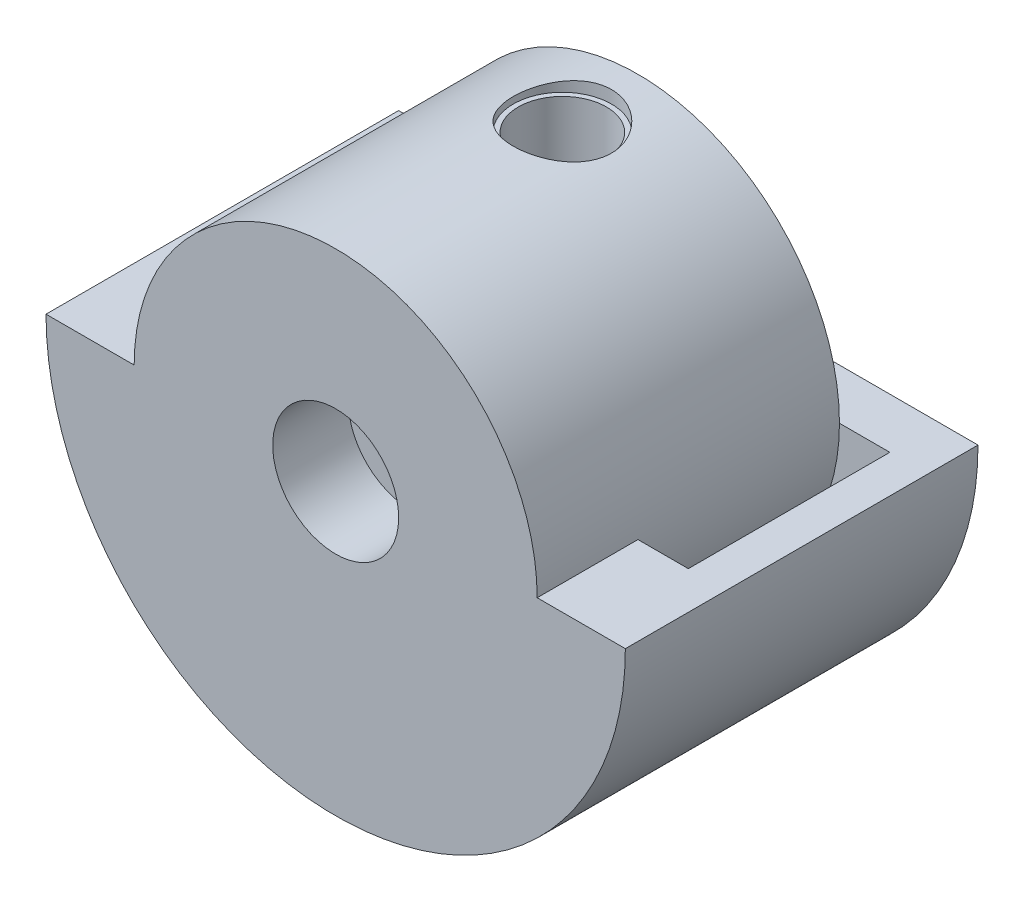
ISO-10303-21;
HEADER;
FILE_DESCRIPTION(('STEP AP214'),'2;1');
FILE_NAME('part.step','',(''),(''),'','','');
FILE_SCHEMA(('AUTOMOTIVE_DESIGN { 1 0 10303 214 1 1 1 1 }'));
ENDSEC;
DATA;
#1=APPLICATION_CONTEXT('core data for automotive mechanical design processes');
#2=APPLICATION_PROTOCOL_DEFINITION('international standard','automotive_design',2000,#1);
#3=PRODUCT_CONTEXT('',#1,'mechanical');
#4=PRODUCT('Part','Part','',(#3));
#5=PRODUCT_RELATED_PRODUCT_CATEGORY('part','',(#4));
#6=PRODUCT_DEFINITION_FORMATION('','',#4);
#7=PRODUCT_DEFINITION_CONTEXT('part definition',#1,'design');
#8=PRODUCT_DEFINITION('design','',#6,#7);
#9=PRODUCT_DEFINITION_SHAPE('','',#8);
#10=(LENGTH_UNIT() NAMED_UNIT(*) SI_UNIT(.MILLI.,.METRE.));
#11=(NAMED_UNIT(*) PLANE_ANGLE_UNIT() SI_UNIT($,.RADIAN.));
#12=(NAMED_UNIT(*) SI_UNIT($,.STERADIAN.) SOLID_ANGLE_UNIT());
#13=UNCERTAINTY_MEASURE_WITH_UNIT(LENGTH_MEASURE(1.E-05),#10,'distance_accuracy_value','');
#14=(GEOMETRIC_REPRESENTATION_CONTEXT(3) GLOBAL_UNCERTAINTY_ASSIGNED_CONTEXT((#13)) GLOBAL_UNIT_ASSIGNED_CONTEXT((#10,
#11,#12)) REPRESENTATION_CONTEXT('',''));
#15=CARTESIAN_POINT('',(0.,0.,0.));
#16=DIRECTION('',(0.,0.,1.));
#17=DIRECTION('',(1.,0.,0.));
#18=AXIS2_PLACEMENT_3D('',#15,#16,#17);
#19=CARTESIAN_POINT('',(0.,0.,-6.));
#20=DIRECTION('',(0.,0.,1.));
#21=DIRECTION('',(1.,0.,0.));
#22=AXIS2_PLACEMENT_3D('',#19,#20,#21);
#23=CYLINDRICAL_SURFACE('',#22,5.);
#24=CARTESIAN_POINT('',(0.,0.,-6.));
#25=DIRECTION('',(0.,0.,1.));
#26=DIRECTION('',(1.,0.,0.));
#27=AXIS2_PLACEMENT_3D('',#24,#25,#26);
#28=CIRCLE('',#27,5.);
#29=CARTESIAN_POINT('',(-5.,0.,-6.));
#30=VERTEX_POINT('',#29);
#31=CARTESIAN_POINT('',(5.,0.,-6.));
#32=VERTEX_POINT('',#31);
#33=EDGE_CURVE('E126',#30,#32,#28,.T.);
#34=ORIENTED_EDGE('',*,*,#33,.T.);
#35=DIRECTION('',(0.,0.,1.));
#36=VECTOR('',#35,1.);
#37=CARTESIAN_POINT('',(5.,0.,-8.));
#38=LINE('',#37,#36);
#39=CARTESIAN_POINT('',(5.,0.,-8.));
#40=VERTEX_POINT('',#39);
#41=EDGE_CURVE('E130',#40,#32,#38,.T.);
#42=ORIENTED_EDGE('',*,*,#41,.F.);
#43=CARTESIAN_POINT('',(0.,0.,-8.));
#44=DIRECTION('',(0.,0.,1.));
#45=DIRECTION('',(-1.,0.,0.));
#46=AXIS2_PLACEMENT_3D('',#43,#44,#45);
#47=CIRCLE('',#46,5.);
#48=CARTESIAN_POINT('',(-5.,0.,-8.));
#49=VERTEX_POINT('',#48);
#50=EDGE_CURVE('E159',#49,#40,#47,.T.);
#51=ORIENTED_EDGE('',*,*,#50,.F.);
#52=DIRECTION('',(0.,0.,1.));
#53=VECTOR('',#52,1.);
#54=CARTESIAN_POINT('',(-5.,0.,-8.));
#55=LINE('',#54,#53);
#56=EDGE_CURVE('E133',#49,#30,#55,.T.);
#57=ORIENTED_EDGE('',*,*,#56,.T.);
#58=EDGE_LOOP('',(#34,#42,#51,#57));
#59=FACE_BOUND('',#58,.T.);
#60=ADVANCED_FACE('F49',(#59),#23,.F.);
#61=CARTESIAN_POINT('',(0.,0.,-6.));
#62=DIRECTION('',(0.,0.,1.));
#63=DIRECTION('',(1.,0.,0.));
#64=AXIS2_PLACEMENT_3D('',#61,#62,#63);
#65=PLANE('',#64);
#66=DIRECTION('',(1.,0.,0.));
#67=VECTOR('',#66,1.);
#68=CARTESIAN_POINT('',(-10.,0.,-6.));
#69=LINE('',#68,#67);
#70=CARTESIAN_POINT('',(-8.,0.,-6.));
#71=VERTEX_POINT('',#70);
#72=EDGE_CURVE('E78',#71,#30,#69,.T.);
#73=ORIENTED_EDGE('',*,*,#72,.F.);
#74=CARTESIAN_POINT('',(0.,0.,-6.));
#75=DIRECTION('',(0.,0.,1.));
#76=DIRECTION('',(1.,0.,0.));
#77=AXIS2_PLACEMENT_3D('',#74,#75,#76);
#78=CIRCLE('',#77,8.);
#79=CARTESIAN_POINT('',(8.,0.,-6.));
#80=VERTEX_POINT('',#79);
#81=EDGE_CURVE('E142',#80,#71,#78,.T.);
#82=ORIENTED_EDGE('',*,*,#81,.F.);
#83=DIRECTION('',(1.,0.,0.));
#84=VECTOR('',#83,1.);
#85=CARTESIAN_POINT('',(14.9666295470958,0.,-6.));
#86=LINE('',#85,#84);
#87=EDGE_CURVE('E139',#32,#80,#86,.T.);
#88=ORIENTED_EDGE('',*,*,#87,.F.);
#89=ORIENTED_EDGE('',*,*,#33,.F.);
#90=EDGE_LOOP('',(#73,#82,#88,#89));
#91=FACE_BOUND('',#90,.T.);
#92=CARTESIAN_POINT('',(0.,0.,-6.));
#93=DIRECTION('',(0.,0.,1.));
#94=DIRECTION('',(1.,0.,0.));
#95=AXIS2_PLACEMENT_3D('',#92,#93,#94);
#96=CIRCLE('',#95,3.5);
#97=CARTESIAN_POINT('',(3.5,0.,-6.));
#98=VERTEX_POINT('',#97);
#99=EDGE_CURVE('E135',#98,#98,#96,.T.);
#100=ORIENTED_EDGE('',*,*,#99,.T.);
#101=EDGE_LOOP('',(#100));
#102=FACE_BOUND('',#101,.T.);
#103=ADVANCED_FACE('F140',(#91,#102),#65,.F.);
#104=CARTESIAN_POINT('',(0.,-4.,-3.));
#105=DIRECTION('',(0.,1.,0.));
#106=DIRECTION('',(0.,0.,1.));
#107=AXIS2_PLACEMENT_3D('',#104,#105,#106);
#108=CYLINDRICAL_SURFACE('',#107,1.75);
#109=CARTESIAN_POINT('',(0.,7.5,-3.));
#110=DIRECTION('',(0.,1.,0.));
#111=DIRECTION('',(0.,0.,1.));
#112=AXIS2_PLACEMENT_3D('',#109,#110,#111);
#113=CIRCLE('',#112,1.75);
#114=CARTESIAN_POINT('',(0.,7.5,-1.25));
#115=VERTEX_POINT('',#114);
#116=EDGE_CURVE('E208',#115,#115,#113,.F.);
#117=ORIENTED_EDGE('',*,*,#116,.F.);
#118=EDGE_LOOP('',(#117));
#119=FACE_BOUND('',#118,.T.);
#120=CARTESIAN_POINT('',(0.,3.5,-1.25));
#121=CARTESIAN_POINT('',(-0.0920009351646585,3.49999498458822,-1.25000577905509));
#122=CARTESIAN_POINT('',(-0.184111549470734,3.49633359284574,-1.25729762796185));
#123=CARTESIAN_POINT('',(-0.365610411720568,3.48204773065025,-1.28614254059769));
#124=CARTESIAN_POINT('',(-0.454993151748852,3.47141003700609,-1.30772268774618));
#125=CARTESIAN_POINT('',(-0.628133703540786,3.44428488955907,-1.3640891650791));
#126=CARTESIAN_POINT('',(-0.711911905143506,3.4278201856069,-1.39882417243394));
#127=CARTESIAN_POINT('',(-0.872327079411548,3.39055108902582,-1.48024858738872));
#128=CARTESIAN_POINT('',(-0.948964614482603,3.36974703858669,-1.52693705243551));
#129=CARTESIAN_POINT('',(-1.09813868108334,3.32423451951608,-1.63415518659925));
#130=CARTESIAN_POINT('',(-1.17014661946369,3.2993659847319,-1.69535133866937));
#131=CARTESIAN_POINT('',(-1.30336402851721,3.249049479318,-1.82841258868231));
#132=CARTESIAN_POINT('',(-1.36456527043684,3.22360108365811,-1.90028574060177));
#133=CARTESIAN_POINT('',(-1.47919100078799,3.17273164595358,-2.05934586166592));
#134=CARTESIAN_POINT('',(-1.53164433721536,3.14746577197731,-2.14728817210535));
#135=CARTESIAN_POINT('',(-1.62079439705872,3.10250462851561,-2.33214283797588));
#136=CARTESIAN_POINT('',(-1.65750237619108,3.08280538312232,-2.42904872526481));
#137=CARTESIAN_POINT('',(-1.71173177383003,3.05301267316165,-2.62316393448836));
#138=CARTESIAN_POINT('',(-1.73027024989077,3.04241475271499,-2.72000779111794));
#139=CARTESIAN_POINT('',(-1.75074723829048,3.03068307409923,-2.91596296611408));
#140=CARTESIAN_POINT('',(-1.75270215465288,3.02953996350754,-3.01507194652452));
#141=CARTESIAN_POINT('',(-1.74070275255151,3.03644127950185,-3.20000054255189));
#142=CARTESIAN_POINT('',(-1.72862297918944,3.04340336408524,-3.28599205464034));
#143=CARTESIAN_POINT('',(-1.69214473584963,3.06383400284238,-3.45451334140282));
#144=CARTESIAN_POINT('',(-1.66774234182089,3.07730462955608,-3.5370420042843));
#145=CARTESIAN_POINT('',(-1.60686711567551,3.10953083722297,-3.6986509819899));
#146=CARTESIAN_POINT('',(-1.57012636745299,3.12840221161997,-3.77760619787513));
#147=CARTESIAN_POINT('',(-1.485822953419,3.16930957492456,-3.92861001203251));
#148=CARTESIAN_POINT('',(-1.43825542667182,3.19134698365334,-4.00065548730016));
#149=CARTESIAN_POINT('',(-1.32661559609738,3.2394802633075,-4.14541219230065));
#150=CARTESIAN_POINT('',(-1.26121530214624,3.26573642914306,-4.21704952875828));
#151=CARTESIAN_POINT('',(-1.1192222627974,3.31708340775713,-4.34878698253408));
#152=CARTESIAN_POINT('',(-1.042624199005,3.34217365927902,-4.40888158605929));
#153=CARTESIAN_POINT('',(-0.875903885205735,3.38978477745187,-4.51844990680202));
#154=CARTESIAN_POINT('',(-0.785318785298965,3.41213222283513,-4.56730082678005));
#155=CARTESIAN_POINT('',(-0.595815877105394,3.45026291962174,-4.64866980082527));
#156=CARTESIAN_POINT('',(-0.496904758464233,3.46605138151218,-4.68120082377654));
#157=CARTESIAN_POINT('',(-0.302341360406229,3.48817584047512,-4.72633195650418));
#158=CARTESIAN_POINT('',(-0.207097678459571,3.49518642027292,-4.74035966255687));
#159=CARTESIAN_POINT('',(-0.0153642999113658,3.50127773553431,-4.75256327948535));
#160=CARTESIAN_POINT('',(0.0811247847723399,3.50036222762308,-4.75074669986907));
#161=CARTESIAN_POINT('',(0.264657700975477,3.49109586443511,-4.7321382952672));
#162=CARTESIAN_POINT('',(0.351853964087378,3.48332679954295,-4.71651806772251));
#163=CARTESIAN_POINT('',(0.522212061528397,3.4618879980097,-4.67258337418354));
#164=CARTESIAN_POINT('',(0.605373449959402,3.44821761085221,-4.64426750870639));
#165=CARTESIAN_POINT('',(0.768055064786752,3.41572439973779,-4.57500268374219));
#166=CARTESIAN_POINT('',(0.847403194760155,3.39676543096854,-4.5337156622965));
#167=CARTESIAN_POINT('',(0.998307382973725,3.35551955055481,-4.44006181261851));
#168=CARTESIAN_POINT('',(1.06986010210903,3.33323122242142,-4.38769026445806));
#169=CARTESIAN_POINT('',(1.21059345625613,3.28489387338346,-4.26741925567125));
#170=CARTESIAN_POINT('',(1.2788511361833,3.25869048476124,-4.19849998022099));
#171=CARTESIAN_POINT('',(1.403248561958,3.20709185315435,-4.05013098526398));
#172=CARTESIAN_POINT('',(1.45937992499578,3.18169717950082,-3.97067404201614));
#173=CARTESIAN_POINT('',(1.56048885033828,3.13339586361356,-3.79862360519729));
#174=CARTESIAN_POINT('',(1.60479461765043,3.11066926780856,-3.70558028433466));
#175=CARTESIAN_POINT('',(1.67664494538573,3.07254626514736,-3.51185738174381));
#176=CARTESIAN_POINT('',(1.70421110276728,3.05714041888062,-3.41118782868294));
#177=CARTESIAN_POINT('',(1.73925795306703,3.03732626795153,-3.21540710995177));
#178=CARTESIAN_POINT('',(1.74841274370954,3.03200421063864,-3.12069005648833));
#179=CARTESIAN_POINT('',(1.75120602015835,3.03039370622806,-2.93096763246208));
#180=CARTESIAN_POINT('',(1.74485123159067,3.03410134346182,-2.83596240470874));
#181=CARTESIAN_POINT('',(1.71837071978829,3.04916258589384,-2.65790387231648));
#182=CARTESIAN_POINT('',(1.69961455010031,3.05975415344652,-2.57457417724671));
#183=CARTESIAN_POINT('',(1.65055687689272,3.08649278328392,-2.41233579100736));
#184=CARTESIAN_POINT('',(1.62025165952986,3.1026416324692,-2.33342853133894));
#185=CARTESIAN_POINT('',(1.54667755427599,3.13999928137937,-2.17640651077356));
#186=CARTESIAN_POINT('',(1.50267449117748,3.16147514192861,-2.0987011717992));
#187=CARTESIAN_POINT('',(1.40376420036544,3.20661830361006,-1.9512695616828));
#188=CARTESIAN_POINT('',(1.34885129967273,3.23028674142319,-1.88154747158805));
#189=CARTESIAN_POINT('',(1.2218558216574,3.28059065526661,-1.74325153087932));
#190=CARTESIAN_POINT('',(1.14849774024521,3.30723720786599,-1.67584657088699));
#191=CARTESIAN_POINT('',(0.990770910908094,3.35786066454879,-1.55403977898828));
#192=CARTESIAN_POINT('',(0.906396265784094,3.38183612595841,-1.49964495592766));
#193=CARTESIAN_POINT('',(0.727880294370154,3.4247151674144,-1.40533636525388));
#194=CARTESIAN_POINT('',(0.633674131609277,3.44358168864383,-1.36552770383618));
#195=CARTESIAN_POINT('',(0.43879867699165,3.47377347273227,-1.30283570642453));
#196=CARTESIAN_POINT('',(0.338148649280924,3.48512015885369,-1.27990426809));
#197=CARTESIAN_POINT('',(0.197053406359066,3.49467058348586,-1.26067953059995));
#198=CARTESIAN_POINT('',(0.157783289022738,3.49666389345439,-1.2566803784839));
#199=CARTESIAN_POINT('',(0.0790155306589105,3.49932969709427,-1.25133933535035));
#200=CARTESIAN_POINT('',(0.0395178833815999,3.50000215430917,-1.24999751767714));
#201=CARTESIAN_POINT('',(0.,3.5,-1.25));
#202=B_SPLINE_CURVE_WITH_KNOTS('',3,(#120,#121,#122,#123,#124,#125,#126,#127,#128,#129,#130,
#131,#132,#133,#134,#135,#136,#137,#138,#139,#140,#141,#142,#143,#144,#145,#146,#147,#148,#149,
#150,#151,#152,#153,#154,#155,#156,#157,#158,#159,#160,#161,#162,#163,#164,#165,#166,#167,#168,
#169,#170,#171,#172,#173,#174,#175,#176,#177,#178,#179,#180,#181,#182,#183,#184,#185,#186,#187,
#188,#189,#190,#191,#192,#193,#194,#195,#196,#197,#198,#199,#200,#201),.UNSPECIFIED.,.T.,.F.,(4,
2,2,2,2,2,2,2,2,2,2,2,2,2,2,2,2,2,2,2,2,2,2,2,2,2,2,2,2,2,2,2,2,2,2,2,2,2,2,2,4),(0.,
0.275842450485512,0.552209261991096,0.827508772111522,1.10278658101774,1.39471807775666,
1.68687091589456,2.00168021253817,2.31626408821992,2.61201521245402,2.90747375325786,
3.16759996716311,3.42780906869937,3.69407920294853,3.96046912205388,4.26063647334287,
4.56094685547701,4.87520288875271,5.18920879596489,5.47720758324855,5.76506987895083,
6.03062086385713,6.2962011285413,6.56937498048822,6.84266538809594,7.14279318627733,
7.44312780077005,7.7580069378302,8.07247895904539,8.35676288130331,8.64092354763187,
8.89801377935497,9.15518675379614,9.42963799365502,9.70423232001354,10.0121917482505,
10.3203167091718,10.6306202391117,10.9400359008701,11.0585174023435,11.1770021739437),.UNSPECIFIED.);
#203=CARTESIAN_POINT('',(0.,3.5,-1.25));
#204=VERTEX_POINT('',#203);
#205=EDGE_CURVE('E242',#204,#204,#202,.T.);
#206=ORIENTED_EDGE('',*,*,#205,.T.);
#207=EDGE_LOOP('',(#206));
#208=FACE_BOUND('',#207,.T.);
#209=ADVANCED_FACE('F235',(#119,#208),#108,.F.);
#210=CARTESIAN_POINT('',(0.,0.,6.));
#211=DIRECTION('',(0.,0.,1.));
#212=DIRECTION('',(1.,0.,0.));
#213=AXIS2_PLACEMENT_3D('',#210,#211,#212);
#214=PLANE('',#213);
#215=CARTESIAN_POINT('',(0.,0.,6.));
#216=DIRECTION('',(0.,0.,1.));
#217=DIRECTION('',(-1.,0.,0.));
#218=AXIS2_PLACEMENT_3D('',#215,#216,#217);
#219=CIRCLE('',#218,11.5);
#220=CARTESIAN_POINT('',(-11.5,0.,6.));
#221=VERTEX_POINT('',#220);
#222=CARTESIAN_POINT('',(11.5,0.,6.));
#223=VERTEX_POINT('',#222);
#224=EDGE_CURVE('E319',#221,#223,#219,.T.);
#225=ORIENTED_EDGE('',*,*,#224,.T.);
#226=DIRECTION('',(-1.,0.,0.));
#227=VECTOR('',#226,1.);
#228=CARTESIAN_POINT('',(8.,0.,6.));
#229=LINE('',#228,#227);
#230=CARTESIAN_POINT('',(8.,0.,6.));
#231=VERTEX_POINT('',#230);
#232=EDGE_CURVE('E194',#223,#231,#229,.T.);
#233=ORIENTED_EDGE('',*,*,#232,.T.);
#234=CARTESIAN_POINT('',(0.,0.,6.));
#235=DIRECTION('',(0.,0.,1.));
#236=DIRECTION('',(1.,0.,0.));
#237=AXIS2_PLACEMENT_3D('',#234,#235,#236);
#238=CIRCLE('',#237,8.);
#239=CARTESIAN_POINT('',(-8.,0.,6.));
#240=VERTEX_POINT('',#239);
#241=EDGE_CURVE('E212',#231,#240,#238,.T.);
#242=ORIENTED_EDGE('',*,*,#241,.T.);
#243=DIRECTION('',(-1.,0.,0.));
#244=VECTOR('',#243,1.);
#245=CARTESIAN_POINT('',(-8.,0.,6.));
#246=LINE('',#245,#244);
#247=EDGE_CURVE('E187',#240,#221,#246,.T.);
#248=ORIENTED_EDGE('',*,*,#247,.T.);
#249=EDGE_LOOP('',(#225,#233,#242,#248));
#250=FACE_BOUND('',#249,.T.);
#251=CARTESIAN_POINT('',(0.,0.,6.));
#252=DIRECTION('',(0.,0.,1.));
#253=DIRECTION('',(1.,0.,0.));
#254=AXIS2_PLACEMENT_3D('',#251,#252,#253);
#255=CIRCLE('',#254,2.5);
#256=CARTESIAN_POINT('',(2.5,0.,6.));
#257=VERTEX_POINT('',#256);
#258=EDGE_CURVE('E220',#257,#257,#255,.T.);
#259=ORIENTED_EDGE('',*,*,#258,.F.);
#260=EDGE_LOOP('',(#259));
#261=FACE_BOUND('',#260,.T.);
#262=ADVANCED_FACE('F238',(#250,#261),#214,.T.);
#263=CARTESIAN_POINT('',(0.,0.,0.));
#264=DIRECTION('',(0.,0.,1.));
#265=DIRECTION('',(1.,0.,0.));
#266=AXIS2_PLACEMENT_3D('',#263,#264,#265);
#267=PLANE('',#266);
#268=CARTESIAN_POINT('',(0.,0.,0.));
#269=DIRECTION('',(0.,0.,-1.));
#270=DIRECTION('',(-1.,0.,0.));
#271=AXIS2_PLACEMENT_3D('',#268,#269,#270);
#272=CIRCLE('',#271,3.5);
#273=CARTESIAN_POINT('',(-3.5,0.,0.));
#274=VERTEX_POINT('',#273);
#275=EDGE_CURVE('E136',#274,#274,#272,.T.);
#276=ORIENTED_EDGE('',*,*,#275,.T.);
#277=EDGE_LOOP('',(#276));
#278=FACE_BOUND('',#277,.T.);
#279=CARTESIAN_POINT('',(0.,0.,0.));
#280=DIRECTION('',(0.,0.,1.));
#281=DIRECTION('',(1.,0.,0.));
#282=AXIS2_PLACEMENT_3D('',#279,#280,#281);
#283=CIRCLE('',#282,1.25);
#284=CARTESIAN_POINT('',(1.25,0.,0.));
#285=VERTEX_POINT('',#284);
#286=EDGE_CURVE('E211',#285,#285,#283,.T.);
#287=ORIENTED_EDGE('',*,*,#286,.T.);
#288=EDGE_LOOP('',(#287));
#289=FACE_BOUND('',#288,.T.);
#290=ADVANCED_FACE('F51',(#278,#289),#267,.F.);
#291=CARTESIAN_POINT('',(0.,0.,6.));
#292=DIRECTION('',(0.,0.,-1.));
#293=DIRECTION('',(-1.,0.,0.));
#294=AXIS2_PLACEMENT_3D('',#291,#292,#293);
#295=CYLINDRICAL_SURFACE('',#294,2.5);
#296=CARTESIAN_POINT('',(0.,0.,3.));
#297=DIRECTION('',(0.,0.,1.));
#298=DIRECTION('',(1.,0.,0.));
#299=AXIS2_PLACEMENT_3D('',#296,#297,#298);
#300=CIRCLE('',#299,2.5);
#301=CARTESIAN_POINT('',(2.5,0.,3.));
#302=VERTEX_POINT('',#301);
#303=EDGE_CURVE('E63',#302,#302,#300,.T.);
#304=ORIENTED_EDGE('',*,*,#303,.F.);
#305=EDGE_LOOP('',(#304));
#306=FACE_BOUND('',#305,.T.);
#307=ORIENTED_EDGE('',*,*,#258,.T.);
#308=EDGE_LOOP('',(#307));
#309=FACE_BOUND('',#308,.T.);
#310=ADVANCED_FACE('F307',(#306,#309),#295,.F.);
#311=CARTESIAN_POINT('',(0.,0.,3.));
#312=DIRECTION('',(0.,0.,1.));
#313=DIRECTION('',(1.,0.,0.));
#314=AXIS2_PLACEMENT_3D('',#311,#312,#313);
#315=PLANE('',#314);
#316=CARTESIAN_POINT('',(0.,0.,3.));
#317=DIRECTION('',(0.,0.,1.));
#318=DIRECTION('',(1.,0.,0.));
#319=AXIS2_PLACEMENT_3D('',#316,#317,#318);
#320=CIRCLE('',#319,1.25);
#321=CARTESIAN_POINT('',(1.25,0.,3.));
#322=VERTEX_POINT('',#321);
#323=EDGE_CURVE('E219',#322,#322,#320,.F.);
#324=ORIENTED_EDGE('',*,*,#323,.T.);
#325=EDGE_LOOP('',(#324));
#326=FACE_BOUND('',#325,.T.);
#327=ORIENTED_EDGE('',*,*,#303,.T.);
#328=EDGE_LOOP('',(#327));
#329=FACE_BOUND('',#328,.T.);
#330=ADVANCED_FACE('F303',(#326,#329),#315,.T.);
#331=CARTESIAN_POINT('',(0.,0.,6.));
#332=DIRECTION('',(0.,0.,-1.));
#333=DIRECTION('',(-1.,0.,0.));
#334=AXIS2_PLACEMENT_3D('',#331,#332,#333);
#335=CYLINDRICAL_SURFACE('',#334,1.25);
#336=ORIENTED_EDGE('',*,*,#323,.F.);
#337=EDGE_LOOP('',(#336));
#338=FACE_BOUND('',#337,.T.);
#339=ORIENTED_EDGE('',*,*,#286,.F.);
#340=EDGE_LOOP('',(#339));
#341=FACE_BOUND('',#340,.T.);
#342=ADVANCED_FACE('F299',(#338,#341),#335,.F.);
#343=CARTESIAN_POINT('',(0.,0.,-6.));
#344=DIRECTION('',(0.,0.,1.));
#345=DIRECTION('',(1.,0.,0.));
#346=AXIS2_PLACEMENT_3D('',#343,#344,#345);
#347=CYLINDRICAL_SURFACE('',#346,8.);
#348=DIRECTION('',(0.,0.,1.));
#349=VECTOR('',#348,1.);
#350=CARTESIAN_POINT('',(8.,0.,-4.));
#351=LINE('',#350,#349);
#352=CARTESIAN_POINT('',(8.,0.,2.));
#353=VERTEX_POINT('',#352);
#354=EDGE_CURVE('E198',#353,#231,#351,.T.);
#355=ORIENTED_EDGE('',*,*,#354,.F.);
#356=CARTESIAN_POINT('',(0.,0.,2.));
#357=DIRECTION('',(0.,0.,1.));
#358=DIRECTION('',(-1.,0.,0.));
#359=AXIS2_PLACEMENT_3D('',#356,#357,#358);
#360=CIRCLE('',#359,8.);
#361=CARTESIAN_POINT('',(-8.,0.,2.));
#362=VERTEX_POINT('',#361);
#363=EDGE_CURVE('E167',#362,#353,#360,.T.);
#364=ORIENTED_EDGE('',*,*,#363,.F.);
#365=DIRECTION('',(0.,0.,1.));
#366=VECTOR('',#365,1.);
#367=CARTESIAN_POINT('',(-8.,0.,-4.));
#368=LINE('',#367,#366);
#369=EDGE_CURVE('E197',#362,#240,#368,.T.);
#370=ORIENTED_EDGE('',*,*,#369,.T.);
#371=ORIENTED_EDGE('',*,*,#241,.F.);
#372=EDGE_LOOP('',(#355,#364,#370,#371));
#373=FACE_BOUND('',#372,.T.);
#374=CARTESIAN_POINT('',(0.,8.,-1.05));
#375=CARTESIAN_POINT('',(0.107825541490164,7.99999812398273,-1.05000317816823));
#376=CARTESIAN_POINT('',(0.215687152153546,7.99779824841766,-1.05897345823791));
#377=CARTESIAN_POINT('',(0.42832480514805,7.98923551729992,-1.09456731109092));
#378=CARTESIAN_POINT('',(0.533098964159805,7.98287017361838,-1.12120143501808));
#379=CARTESIAN_POINT('',(0.736459839202563,7.96668218515695,-1.19122206251654));
#380=CARTESIAN_POINT('',(0.835053629702962,7.95686358162135,-1.23458898993341));
#381=CARTESIAN_POINT('',(1.02356595357982,7.93481767763216,-1.33677669815237));
#382=CARTESIAN_POINT('',(1.1134842999433,7.92259032527145,-1.39559781199226));
#383=CARTESIAN_POINT('',(1.28386086698915,7.89678825782025,-1.52824554536406));
#384=CARTESIAN_POINT('',(1.36412430075997,7.88319358507604,-1.60231848746785));
#385=CARTESIAN_POINT('',(1.51122051014568,7.85632331426188,-1.76283954027465));
#386=CARTESIAN_POINT('',(1.57805184087065,7.84304775065356,-1.84928898060542));
#387=CARTESIAN_POINT('',(1.69729088412022,7.81811858876697,-2.03360632487501));
#388=CARTESIAN_POINT('',(1.74948291477334,7.80649037982793,-2.1316175031967));
#389=CARTESIAN_POINT('',(1.8365755587542,7.78646266441492,-2.33535130798383));
#390=CARTESIAN_POINT('',(1.87147878716349,7.77806266968861,-2.4410727654255));
#391=CARTESIAN_POINT('',(1.92234287708522,7.76564722121663,-2.65509002801778));
#392=CARTESIAN_POINT('',(1.93865287997234,7.76155106978318,-2.76329806663435));
#393=CARTESIAN_POINT('',(1.95295467836058,7.75796537465037,-2.98098604984639));
#394=CARTESIAN_POINT('',(1.95094929819327,7.75847512069647,-3.09046579573734));
#395=CARTESIAN_POINT('',(1.92895632159768,7.76397097561509,-3.30493080034139));
#396=CARTESIAN_POINT('',(1.90938252355569,7.76885407095745,-3.40996154280224));
#397=CARTESIAN_POINT('',(1.85346748882609,7.78238252959748,-3.6152017537729));
#398=CARTESIAN_POINT('',(1.81712511033683,7.79102814908965,-3.71541089345824));
#399=CARTESIAN_POINT('',(1.72834625372847,7.81120351135204,-3.90928412098974));
#400=CARTESIAN_POINT('',(1.67575774022247,7.82276030051405,-4.00287565586842));
#401=CARTESIAN_POINT('',(1.55608584838053,7.84744030507865,-4.18005517678226));
#402=CARTESIAN_POINT('',(1.48900004948235,7.86056378190176,-4.26364148865356));
#403=CARTESIAN_POINT('',(1.3400845848836,7.8873339673074,-4.42081159648829));
#404=CARTESIAN_POINT('',(1.25790514144594,7.90098522610574,-4.49406360790496));
#405=CARTESIAN_POINT('',(1.08226639751907,7.92695201062349,-4.62580773050369));
#406=CARTESIAN_POINT('',(0.98880678523419,7.93926749940296,-4.68429943355721));
#407=CARTESIAN_POINT('',(0.792801708545604,7.96123158682625,-4.78497589065592));
#408=CARTESIAN_POINT('',(0.69022867892588,7.97087170385544,-4.82710894830801));
#409=CARTESIAN_POINT('',(0.479169077508089,7.98633697733114,-4.89344328075004));
#410=CARTESIAN_POINT('',(0.370683583325712,7.9921628264703,-4.91764781156701));
#411=CARTESIAN_POINT('',(0.153717168488067,7.99924145808818,-4.94693639541024));
#412=CARTESIAN_POINT('',(0.0453007166825698,8.00060234885088,-4.95247255231614));
#413=CARTESIAN_POINT('',(-0.170909058374862,7.99890459808067,-4.94550417219437));
#414=CARTESIAN_POINT('',(-0.278702433987297,7.99584633349827,-4.93300117389267));
#415=CARTESIAN_POINT('',(-0.489050481826631,7.98572296905669,-4.89068260603054));
#416=CARTESIAN_POINT('',(-0.591657346380781,7.97871452374987,-4.86111168799673));
#417=CARTESIAN_POINT('',(-0.790450216782407,7.96147928584442,-4.7857744748086));
#418=CARTESIAN_POINT('',(-0.88663559218345,7.95125217780675,-4.74000659224629));
#419=CARTESIAN_POINT('',(-1.07166885553698,7.92845331331329,-4.63268476350985));
#420=CARTESIAN_POINT('',(-1.16036369334166,7.915844556532,-4.57087499034521));
#421=CARTESIAN_POINT('',(-1.32628320089302,7.88974265905516,-4.43355294598075));
#422=CARTESIAN_POINT('',(-1.40350599043646,7.8762493739116,-4.35803843314808));
#423=CARTESIAN_POINT('',(-1.54613688310293,7.84951325345627,-4.19335590415998));
#424=CARTESIAN_POINT('',(-1.6112286114313,7.83628353162478,-4.10391130413756));
#425=CARTESIAN_POINT('',(-1.72547550781794,7.81192421325621,-3.9150997460516));
#426=CARTESIAN_POINT('',(-1.774631388641,7.80079452280006,-3.81573323202694));
#427=CARTESIAN_POINT('',(-1.85524968511174,7.78201534298735,-3.61043781734871));
#428=CARTESIAN_POINT('',(-1.88681679118352,7.77434531454056,-3.5045520039245));
#429=CARTESIAN_POINT('',(-1.93164528513614,7.76332978239116,-3.28876216712247));
#430=CARTESIAN_POINT('',(-1.94491044241092,7.75998338821968,-3.178858975935));
#431=CARTESIAN_POINT('',(-1.95256894634341,7.75805948381842,-2.96136695359156));
#432=CARTESIAN_POINT('',(-1.94746702418088,7.75935442438941,-2.85379673187421));
#433=CARTESIAN_POINT('',(-1.91968573190631,7.76627373037302,-2.64109975287782));
#434=CARTESIAN_POINT('',(-1.89700668189059,7.7718980169441,-2.53597295113768));
#435=CARTESIAN_POINT('',(-1.83498419377968,7.78677301395669,-2.33166473916716));
#436=CARTESIAN_POINT('',(-1.79573099287175,7.79600406750628,-2.23245440653527));
#437=CARTESIAN_POINT('',(-1.70174666967727,7.81705617091581,-2.04195873649124));
#438=CARTESIAN_POINT('',(-1.64701350726209,7.82887756211417,-1.95067444573864));
#439=CARTESIAN_POINT('',(-1.52202143543851,7.85414572503987,-1.77617257536622));
#440=CARTESIAN_POINT('',(-1.45141027125362,7.86762560685991,-1.69321205882674));
#441=CARTESIAN_POINT('',(-1.29735891965429,7.89448935051981,-1.54015317381133));
#442=CARTESIAN_POINT('',(-1.21391571184344,7.90787318897475,-1.47005784207521));
#443=CARTESIAN_POINT('',(-1.03485885825304,7.93330779350192,-1.34356234184429));
#444=CARTESIAN_POINT('',(-0.939062604399942,7.94533206279427,-1.28741494851302));
#445=CARTESIAN_POINT('',(-0.739108798054155,7.96641645212532,-1.19211054267637));
#446=CARTESIAN_POINT('',(-0.634957524695249,7.97547877267175,-1.15294090986839));
#447=CARTESIAN_POINT('',(-0.442438530778236,7.98821925812234,-1.09876708428037));
#448=CARTESIAN_POINT('',(-0.355016498300937,7.99260733431618,-1.08051794418029));
#449=CARTESIAN_POINT('',(-0.178404461187009,7.99849838355984,-1.05613349787904));
#450=CARTESIAN_POINT('',(-0.0892145768284118,8.00000155221188,-1.04999737039175));
#451=CARTESIAN_POINT('',(0.,8.,-1.05));
#452=B_SPLINE_CURVE_WITH_KNOTS('',3,(#374,#375,#376,#377,#378,#379,#380,#381,#382,#383,#384,
#385,#386,#387,#388,#389,#390,#391,#392,#393,#394,#395,#396,#397,#398,#399,#400,#401,#402,#403,
#404,#405,#406,#407,#408,#409,#410,#411,#412,#413,#414,#415,#416,#417,#418,#419,#420,#421,#422,
#423,#424,#425,#426,#427,#428,#429,#430,#431,#432,#433,#434,#435,#436,#437,#438,#439,#440,#441,
#442,#443,#444,#445,#446,#447,#448,#449,#450,#451),.UNSPECIFIED.,.T.,.F.,(4,2,2,2,2,2,2,2,2,2,2,
2,2,2,2,2,2,2,2,2,2,2,2,2,2,2,2,2,2,2,2,2,2,2,2,2,2,2,4),(0.,0.323149767425679,
0.646492735965794,0.969458558356098,1.29243134123258,1.62109958545944,1.94980316559493,
2.28312175151942,2.61638990470425,2.94329121266094,3.27014211151138,3.58949087290252,
3.90886138251301,4.23131613346554,4.55382476524249,4.88505850288189,5.21630139826589,
5.5485827249956,5.8808036908021,6.20491893485493,6.52900653376303,6.84856011841651,
7.16814503007939,7.49317840267634,7.81826498775663,8.15090856117375,8.48353725434384,
8.81416435538543,9.14472335166204,9.46626870395887,9.78780820074495,10.1076192156546,
10.4274723986201,10.7552799014246,11.0831646817381,11.4166173816455,11.7498217848863,
12.017213204978,12.2845864947816),.UNSPECIFIED.);
#453=CARTESIAN_POINT('',(0.,8.,-1.05));
#454=VERTEX_POINT('',#453);
#455=EDGE_CURVE('E11',#454,#454,#452,.T.);
#456=ORIENTED_EDGE('',*,*,#455,.F.);
#457=EDGE_LOOP('',(#456));
#458=FACE_BOUND('',#457,.T.);
#459=ORIENTED_EDGE('',*,*,#81,.T.);
#460=EDGE_CURVE('E157',#71,#80,#78,.T.);
#461=ORIENTED_EDGE('',*,*,#460,.T.);
#462=EDGE_LOOP('',(#459,#461));
#463=FACE_BOUND('',#462,.T.);
#464=ADVANCED_FACE('F287',(#373,#458,#463),#347,.T.);
#465=CARTESIAN_POINT('',(0.,7.5,-3.));
#466=DIRECTION('',(0.,1.,0.));
#467=DIRECTION('',(0.,0.,1.));
#468=AXIS2_PLACEMENT_3D('',#465,#466,#467);
#469=PLANE('',#468);
#470=CARTESIAN_POINT('',(0.,7.5,-3.));
#471=DIRECTION('',(0.,1.,0.));
#472=DIRECTION('',(0.,0.,1.));
#473=AXIS2_PLACEMENT_3D('',#470,#471,#472);
#474=CIRCLE('',#473,1.95);
#475=CARTESIAN_POINT('',(0.,7.5,-1.05));
#476=VERTEX_POINT('',#475);
#477=EDGE_CURVE('E202',#476,#476,#474,.T.);
#478=ORIENTED_EDGE('',*,*,#477,.T.);
#479=EDGE_LOOP('',(#478));
#480=FACE_BOUND('',#479,.T.);
#481=ORIENTED_EDGE('',*,*,#116,.T.);
#482=EDGE_LOOP('',(#481));
#483=FACE_BOUND('',#482,.T.);
#484=ADVANCED_FACE('F233',(#480,#483),#469,.T.);
#485=CARTESIAN_POINT('',(0.,7.5,-3.));
#486=DIRECTION('',(0.,1.,0.));
#487=DIRECTION('',(0.,0.,1.));
#488=AXIS2_PLACEMENT_3D('',#485,#486,#487);
#489=CYLINDRICAL_SURFACE('',#488,1.95);
#490=ORIENTED_EDGE('',*,*,#455,.T.);
#491=EDGE_LOOP('',(#490));
#492=FACE_BOUND('',#491,.T.);
#493=ORIENTED_EDGE('',*,*,#477,.F.);
#494=EDGE_LOOP('',(#493));
#495=FACE_BOUND('',#494,.T.);
#496=ADVANCED_FACE('F282',(#492,#495),#489,.F.);
#497=CARTESIAN_POINT('',(8.,0.,-4.));
#498=DIRECTION('',(0.,1.,0.));
#499=DIRECTION('',(0.,0.,1.));
#500=AXIS2_PLACEMENT_3D('',#497,#498,#499);
#501=PLANE('',#500);
#502=DIRECTION('',(0.,0.,-1.));
#503=VECTOR('',#502,1.);
#504=CARTESIAN_POINT('',(11.5,0.,6.));
#505=LINE('',#504,#503);
#506=CARTESIAN_POINT('',(11.5,0.,-8.));
#507=VERTEX_POINT('',#506);
#508=EDGE_CURVE('E327',#223,#507,#505,.T.);
#509=ORIENTED_EDGE('',*,*,#508,.T.);
#510=DIRECTION('',(1.,0.,0.));
#511=VECTOR('',#510,1.);
#512=CARTESIAN_POINT('',(8.,0.,-8.));
#513=LINE('',#512,#511);
#514=EDGE_CURVE('E152',#40,#507,#513,.T.);
#515=ORIENTED_EDGE('',*,*,#514,.F.);
#516=ORIENTED_EDGE('',*,*,#41,.T.);
#517=ORIENTED_EDGE('',*,*,#87,.T.);
#518=CARTESIAN_POINT('',(10.,0.,-6.));
#519=VERTEX_POINT('',#518);
#520=EDGE_CURVE('E147',#80,#519,#86,.T.);
#521=ORIENTED_EDGE('',*,*,#520,.T.);
#522=DIRECTION('',(0.,0.,-1.));
#523=VECTOR('',#522,1.);
#524=CARTESIAN_POINT('',(10.,0.,2.));
#525=LINE('',#524,#523);
#526=CARTESIAN_POINT('',(10.,0.,2.));
#527=VERTEX_POINT('',#526);
#528=EDGE_CURVE('E182',#527,#519,#525,.T.);
#529=ORIENTED_EDGE('',*,*,#528,.F.);
#530=DIRECTION('',(1.,0.,0.));
#531=VECTOR('',#530,1.);
#532=CARTESIAN_POINT('',(10.,0.,2.));
#533=LINE('',#532,#531);
#534=EDGE_CURVE('E170',#353,#527,#533,.T.);
#535=ORIENTED_EDGE('',*,*,#534,.F.);
#536=ORIENTED_EDGE('',*,*,#354,.T.);
#537=ORIENTED_EDGE('',*,*,#232,.F.);
#538=EDGE_LOOP('',(#509,#515,#516,#517,#521,#529,#535,#536,#537));
#539=FACE_BOUND('',#538,.T.);
#540=ADVANCED_FACE('F150',(#539),#501,.T.);
#541=CARTESIAN_POINT('',(-8.,0.,-4.));
#542=DIRECTION('',(0.,1.,0.));
#543=DIRECTION('',(0.,0.,1.));
#544=AXIS2_PLACEMENT_3D('',#541,#542,#543);
#545=PLANE('',#544);
#546=DIRECTION('',(0.,0.,-1.));
#547=VECTOR('',#546,1.);
#548=CARTESIAN_POINT('',(-11.5,0.,6.));
#549=LINE('',#548,#547);
#550=CARTESIAN_POINT('',(-11.5,0.,-8.));
#551=VERTEX_POINT('',#550);
#552=EDGE_CURVE('E70',#221,#551,#549,.T.);
#553=ORIENTED_EDGE('',*,*,#552,.F.);
#554=ORIENTED_EDGE('',*,*,#247,.F.);
#555=ORIENTED_EDGE('',*,*,#369,.F.);
#556=DIRECTION('',(1.,0.,0.));
#557=VECTOR('',#556,1.);
#558=CARTESIAN_POINT('',(-10.,0.,2.));
#559=LINE('',#558,#557);
#560=CARTESIAN_POINT('',(-10.,0.,2.));
#561=VERTEX_POINT('',#560);
#562=EDGE_CURVE('E178',#561,#362,#559,.T.);
#563=ORIENTED_EDGE('',*,*,#562,.F.);
#564=DIRECTION('',(0.,0.,-1.));
#565=VECTOR('',#564,1.);
#566=CARTESIAN_POINT('',(-10.,0.,2.));
#567=LINE('',#566,#565);
#568=CARTESIAN_POINT('',(-10.,0.,-6.));
#569=VERTEX_POINT('',#568);
#570=EDGE_CURVE('E183',#561,#569,#567,.T.);
#571=ORIENTED_EDGE('',*,*,#570,.T.);
#572=EDGE_CURVE('E345',#569,#71,#69,.T.);
#573=ORIENTED_EDGE('',*,*,#572,.T.);
#574=ORIENTED_EDGE('',*,*,#72,.T.);
#575=ORIENTED_EDGE('',*,*,#56,.F.);
#576=DIRECTION('',(1.,0.,0.));
#577=VECTOR('',#576,1.);
#578=CARTESIAN_POINT('',(-10.,0.,-8.));
#579=LINE('',#578,#577);
#580=EDGE_CURVE('E336',#551,#49,#579,.T.);
#581=ORIENTED_EDGE('',*,*,#580,.F.);
#582=EDGE_LOOP('',(#553,#554,#555,#563,#571,#573,#574,#575,#581));
#583=FACE_BOUND('',#582,.T.);
#584=ADVANCED_FACE('F278',(#583),#545,.T.);
#585=CARTESIAN_POINT('',(0.,0.,2.));
#586=DIRECTION('',(0.,0.,-1.));
#587=DIRECTION('',(-1.,0.,0.));
#588=AXIS2_PLACEMENT_3D('',#585,#586,#587);
#589=CYLINDRICAL_SURFACE('',#588,10.);
#590=ORIENTED_EDGE('',*,*,#528,.T.);
#591=CARTESIAN_POINT('',(0.,0.,-6.));
#592=DIRECTION('',(0.,0.,1.));
#593=DIRECTION('',(1.,0.,0.));
#594=AXIS2_PLACEMENT_3D('',#591,#592,#593);
#595=CIRCLE('',#594,10.);
#596=EDGE_CURVE('E163',#519,#569,#595,.F.);
#597=ORIENTED_EDGE('',*,*,#596,.T.);
#598=ORIENTED_EDGE('',*,*,#570,.F.);
#599=CARTESIAN_POINT('',(0.,0.,2.));
#600=DIRECTION('',(0.,0.,-1.));
#601=DIRECTION('',(-1.,0.,0.));
#602=AXIS2_PLACEMENT_3D('',#599,#600,#601);
#603=CIRCLE('',#602,10.);
#604=EDGE_CURVE('E174',#527,#561,#603,.T.);
#605=ORIENTED_EDGE('',*,*,#604,.F.);
#606=EDGE_LOOP('',(#590,#597,#598,#605));
#607=FACE_BOUND('',#606,.T.);
#608=ADVANCED_FACE('F274',(#607),#589,.F.);
#609=CARTESIAN_POINT('',(0.,0.,2.));
#610=DIRECTION('',(0.,0.,-1.));
#611=DIRECTION('',(-1.,0.,0.));
#612=AXIS2_PLACEMENT_3D('',#609,#610,#611);
#613=PLANE('',#612);
#614=ORIENTED_EDGE('',*,*,#363,.T.);
#615=ORIENTED_EDGE('',*,*,#534,.T.);
#616=ORIENTED_EDGE('',*,*,#604,.T.);
#617=ORIENTED_EDGE('',*,*,#562,.T.);
#618=EDGE_LOOP('',(#614,#615,#616,#617));
#619=FACE_BOUND('',#618,.T.);
#620=ADVANCED_FACE('F270',(#619),#613,.T.);
#621=CARTESIAN_POINT('',(0.,0.,-6.));
#622=DIRECTION('',(0.,0.,-1.));
#623=DIRECTION('',(-1.,0.,0.));
#624=AXIS2_PLACEMENT_3D('',#621,#622,#623);
#625=PLANE('',#624);
#626=ORIENTED_EDGE('',*,*,#460,.F.);
#627=ORIENTED_EDGE('',*,*,#572,.F.);
#628=ORIENTED_EDGE('',*,*,#596,.F.);
#629=ORIENTED_EDGE('',*,*,#520,.F.);
#630=EDGE_LOOP('',(#626,#627,#628,#629));
#631=FACE_BOUND('',#630,.T.);
#632=ADVANCED_FACE('F266',(#631),#625,.F.);
#633=CARTESIAN_POINT('',(0.,0.,-8.));
#634=DIRECTION('',(0.,0.,-1.));
#635=DIRECTION('',(-1.,0.,0.));
#636=AXIS2_PLACEMENT_3D('',#633,#634,#635);
#637=PLANE('',#636);
#638=CARTESIAN_POINT('',(0.,0.,-8.));
#639=DIRECTION('',(0.,0.,1.));
#640=DIRECTION('',(-1.,0.,0.));
#641=AXIS2_PLACEMENT_3D('',#638,#639,#640);
#642=CIRCLE('',#641,11.5);
#643=EDGE_CURVE('E325',#551,#507,#642,.T.);
#644=ORIENTED_EDGE('',*,*,#643,.F.);
#645=ORIENTED_EDGE('',*,*,#580,.T.);
#646=ORIENTED_EDGE('',*,*,#50,.T.);
#647=ORIENTED_EDGE('',*,*,#514,.T.);
#648=EDGE_LOOP('',(#644,#645,#646,#647));
#649=FACE_BOUND('',#648,.T.);
#650=ADVANCED_FACE('F263',(#649),#637,.T.);
#651=CARTESIAN_POINT('',(0.,0.,6.));
#652=DIRECTION('',(0.,0.,-1.));
#653=DIRECTION('',(-1.,0.,0.));
#654=AXIS2_PLACEMENT_3D('',#651,#652,#653);
#655=CYLINDRICAL_SURFACE('',#654,11.5);
#656=ORIENTED_EDGE('',*,*,#643,.T.);
#657=ORIENTED_EDGE('',*,*,#508,.F.);
#658=ORIENTED_EDGE('',*,*,#224,.F.);
#659=ORIENTED_EDGE('',*,*,#552,.T.);
#660=EDGE_LOOP('',(#656,#657,#658,#659));
#661=FACE_BOUND('',#660,.T.);
#662=ADVANCED_FACE('F260',(#661),#655,.T.);
#663=CARTESIAN_POINT('',(0.,0.,-20.142135623731));
#664=DIRECTION('',(0.,0.,1.));
#665=DIRECTION('',(1.,0.,0.));
#666=AXIS2_PLACEMENT_3D('',#663,#664,#665);
#667=CYLINDRICAL_SURFACE('',#666,3.5);
#668=ORIENTED_EDGE('',*,*,#205,.F.);
#669=EDGE_LOOP('',(#668));
#670=FACE_BOUND('',#669,.T.);
#671=ORIENTED_EDGE('',*,*,#99,.F.);
#672=EDGE_LOOP('',(#671));
#673=FACE_BOUND('',#672,.T.);
#674=ORIENTED_EDGE('',*,*,#275,.F.);
#675=EDGE_LOOP('',(#674));
#676=FACE_BOUND('',#675,.T.);
#677=ADVANCED_FACE('F255',(#670,#673,#676),#667,.F.);
#678=CLOSED_SHELL('',(#60,#103,#209,#262,#290,#310,#330,#342,#464,#484,#496,#540,#584,#608,#620,
#632,#650,#662,#677));
#679=MANIFOLD_SOLID_BREP('B2',#678);
#680=ADVANCED_BREP_SHAPE_REPRESENTATION('',(#18,#679),#14);
#681=SHAPE_DEFINITION_REPRESENTATION(#9,#680);
ENDSEC;
END-ISO-10303-21;
